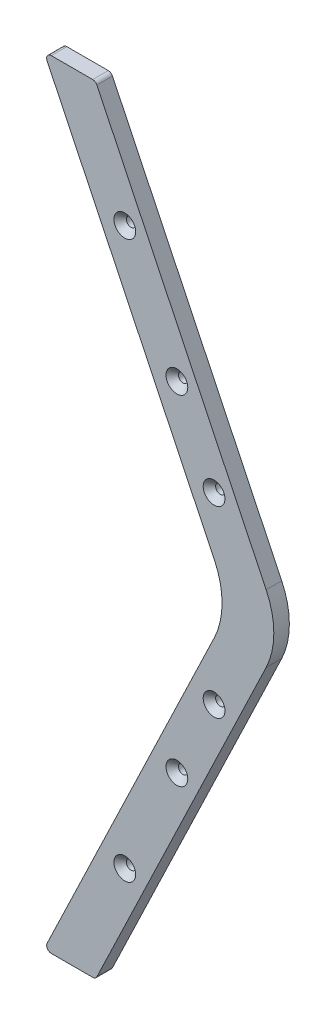
ISO-10303-21;
HEADER;
FILE_DESCRIPTION(('STEP AP214'),'2;1');
FILE_NAME('part.step','',(''),(''),'','','');
FILE_SCHEMA(('AUTOMOTIVE_DESIGN { 1 0 10303 214 1 1 1 1 }'));
ENDSEC;
DATA;
#1=APPLICATION_CONTEXT('core data for automotive mechanical design processes');
#2=APPLICATION_PROTOCOL_DEFINITION('international standard','automotive_design',2000,#1);
#3=PRODUCT_CONTEXT('',#1,'mechanical');
#4=PRODUCT('Part','Part','',(#3));
#5=PRODUCT_RELATED_PRODUCT_CATEGORY('part','',(#4));
#6=PRODUCT_DEFINITION_FORMATION('','',#4);
#7=PRODUCT_DEFINITION_CONTEXT('part definition',#1,'design');
#8=PRODUCT_DEFINITION('design','',#6,#7);
#9=PRODUCT_DEFINITION_SHAPE('','',#8);
#10=(LENGTH_UNIT() NAMED_UNIT(*) SI_UNIT(.MILLI.,.METRE.));
#11=(NAMED_UNIT(*) PLANE_ANGLE_UNIT() SI_UNIT($,.RADIAN.));
#12=(NAMED_UNIT(*) SI_UNIT($,.STERADIAN.) SOLID_ANGLE_UNIT());
#13=UNCERTAINTY_MEASURE_WITH_UNIT(LENGTH_MEASURE(1.E-05),#10,'distance_accuracy_value','');
#14=(GEOMETRIC_REPRESENTATION_CONTEXT(3) GLOBAL_UNCERTAINTY_ASSIGNED_CONTEXT((#13)) GLOBAL_UNIT_ASSIGNED_CONTEXT((#10,
#11,#12)) REPRESENTATION_CONTEXT('',''));
#15=CARTESIAN_POINT('',(0.,0.,0.));
#16=DIRECTION('',(0.,0.,1.));
#17=DIRECTION('',(1.,0.,0.));
#18=AXIS2_PLACEMENT_3D('',#15,#16,#17);
#19=CARTESIAN_POINT('',(-19.6172248803829,250.,10.));
#20=DIRECTION('',(0.,-1.,0.));
#21=DIRECTION('',(1.,0.,0.));
#22=AXIS2_PLACEMENT_3D('',#19,#20,#21);
#23=PLANE('',#22);
#24=DIRECTION('',(-1.,0.,0.));
#25=VECTOR('',#24,1.);
#26=CARTESIAN_POINT('',(-19.6172248803829,250.,0.));
#27=LINE('',#26,#25);
#28=CARTESIAN_POINT('',(11.7747507084557,250.,0.));
#29=VERTEX_POINT('',#28);
#30=CARTESIAN_POINT('',(-14.8487448678703,250.,0.));
#31=VERTEX_POINT('',#30);
#32=EDGE_CURVE('E236',#29,#31,#27,.T.);
#33=ORIENTED_EDGE('',*,*,#32,.T.);
#34=DIRECTION('',(0.,0.,-1.));
#35=VECTOR('',#34,1.);
#36=CARTESIAN_POINT('',(-14.8487448678703,250.,10.));
#37=LINE('',#36,#35);
#38=CARTESIAN_POINT('',(-14.8487448678703,250.,10.));
#39=VERTEX_POINT('',#38);
#40=EDGE_CURVE('E196',#31,#39,#37,.F.);
#41=ORIENTED_EDGE('',*,*,#40,.T.);
#42=DIRECTION('',(-1.,0.,0.));
#43=VECTOR('',#42,1.);
#44=CARTESIAN_POINT('',(-19.6172248803829,250.,10.));
#45=LINE('',#44,#43);
#46=CARTESIAN_POINT('',(11.7747507084557,250.,10.));
#47=VERTEX_POINT('',#46);
#48=EDGE_CURVE('E170',#47,#39,#45,.T.);
#49=ORIENTED_EDGE('',*,*,#48,.F.);
#50=DIRECTION('',(0.,0.,-1.));
#51=VECTOR('',#50,1.);
#52=CARTESIAN_POINT('',(11.7747507084557,250.,10.));
#53=LINE('',#52,#51);
#54=EDGE_CURVE('E193',#47,#29,#53,.T.);
#55=ORIENTED_EDGE('',*,*,#54,.T.);
#56=EDGE_LOOP('',(#33,#41,#49,#55));
#57=FACE_BOUND('',#56,.T.);
#58=ADVANCED_FACE('F40',(#57),#23,.F.);
#59=CARTESIAN_POINT('',(100.428030575602,0.,10.));
#60=DIRECTION('',(0.901459386923673,0.432863689545792,0.));
#61=DIRECTION('',(-0.432863689545792,0.901459386923673,0.));
#62=AXIS2_PLACEMENT_3D('',#59,#60,#61);
#63=PLANE('',#62);
#64=DIRECTION('',(0.432863689545792,-0.901459386923673,0.));
#65=VECTOR('',#64,1.);
#66=CARTESIAN_POINT('',(100.428030575602,0.,0.));
#67=LINE('',#66,#65);
#68=CARTESIAN_POINT('',(-17.5531230286413,245.701408931363,0.));
#69=VERTEX_POINT('',#68);
#70=CARTESIAN_POINT('',(90.0353841377733,21.6431844772896,0.));
#71=VERTEX_POINT('',#70);
#72=EDGE_CURVE('E165',#69,#71,#67,.T.);
#73=ORIENTED_EDGE('',*,*,#72,.T.);
#74=DIRECTION('',(0.,0.,-1.));
#75=VECTOR('',#74,1.);
#76=CARTESIAN_POINT('',(90.0353841377733,21.6431844772896,10.));
#77=LINE('',#76,#75);
#78=CARTESIAN_POINT('',(90.0353841377733,21.6431844772896,10.));
#79=VERTEX_POINT('',#78);
#80=EDGE_CURVE('E56',#71,#79,#77,.F.);
#81=ORIENTED_EDGE('',*,*,#80,.T.);
#82=DIRECTION('',(0.432863689545792,-0.901459386923673,0.));
#83=VECTOR('',#82,1.);
#84=CARTESIAN_POINT('',(100.428030575602,0.,10.));
#85=LINE('',#84,#83);
#86=CARTESIAN_POINT('',(-17.5531230286413,245.701408931363,10.));
#87=VERTEX_POINT('',#86);
#88=EDGE_CURVE('E400',#87,#79,#85,.T.);
#89=ORIENTED_EDGE('',*,*,#88,.F.);
#90=DIRECTION('',(0.,0.,-1.));
#91=VECTOR('',#90,1.);
#92=CARTESIAN_POINT('',(-17.5531230286413,245.701408931363,10.));
#93=LINE('',#92,#91);
#94=EDGE_CURVE('E190',#87,#69,#93,.T.);
#95=ORIENTED_EDGE('',*,*,#94,.T.);
#96=EDGE_LOOP('',(#73,#81,#89,#95));
#97=FACE_BOUND('',#96,.T.);
#98=ADVANCED_FACE('F286',(#97),#63,.F.);
#99=CARTESIAN_POINT('',(100.428030575602,0.,10.));
#100=DIRECTION('',(0.901459386923673,-0.432863689545792,0.));
#101=DIRECTION('',(0.432863689545792,0.901459386923673,0.));
#102=AXIS2_PLACEMENT_3D('',#99,#100,#101);
#103=PLANE('',#102);
#104=DIRECTION('',(-0.432863689545792,-0.901459386923673,0.));
#105=VECTOR('',#104,1.);
#106=CARTESIAN_POINT('',(100.428030575602,0.,10.));
#107=LINE('',#106,#105);
#108=CARTESIAN_POINT('',(90.0353841377733,-21.6431844772896,10.));
#109=VERTEX_POINT('',#108);
#110=CARTESIAN_POINT('',(-17.5531230286412,-245.701408931363,10.));
#111=VERTEX_POINT('',#110);
#112=EDGE_CURVE('E398',#109,#111,#107,.T.);
#113=ORIENTED_EDGE('',*,*,#112,.F.);
#114=DIRECTION('',(0.,0.,-1.));
#115=VECTOR('',#114,1.);
#116=CARTESIAN_POINT('',(90.0353841377733,-21.6431844772896,0.));
#117=LINE('',#116,#115);
#118=CARTESIAN_POINT('',(90.0353841377733,-21.6431844772896,0.));
#119=VERTEX_POINT('',#118);
#120=EDGE_CURVE('E210',#109,#119,#117,.T.);
#121=ORIENTED_EDGE('',*,*,#120,.T.);
#122=DIRECTION('',(-0.432863689545792,-0.901459386923673,0.));
#123=VECTOR('',#122,1.);
#124=CARTESIAN_POINT('',(100.428030575602,0.,0.));
#125=LINE('',#124,#123);
#126=CARTESIAN_POINT('',(-17.5531230286412,-245.701408931363,0.));
#127=VERTEX_POINT('',#126);
#128=EDGE_CURVE('E160',#119,#127,#125,.T.);
#129=ORIENTED_EDGE('',*,*,#128,.T.);
#130=DIRECTION('',(0.,0.,-1.));
#131=VECTOR('',#130,1.);
#132=CARTESIAN_POINT('',(-17.5531230286412,-245.701408931363,10.));
#133=LINE('',#132,#131);
#134=EDGE_CURVE('E139',#127,#111,#133,.F.);
#135=ORIENTED_EDGE('',*,*,#134,.T.);
#136=EDGE_LOOP('',(#113,#121,#129,#135));
#137=FACE_BOUND('',#136,.T.);
#138=ADVANCED_FACE('F292',(#137),#103,.F.);
#139=CARTESIAN_POINT('',(-19.6172248803828,-250.,10.));
#140=DIRECTION('',(0.,1.,0.));
#141=DIRECTION('',(0.,0.,1.));
#142=AXIS2_PLACEMENT_3D('',#139,#140,#141);
#143=PLANE('',#142);
#144=DIRECTION('',(1.,0.,0.));
#145=VECTOR('',#144,1.);
#146=CARTESIAN_POINT('',(-19.6172248803828,-250.,10.));
#147=LINE('',#146,#145);
#148=CARTESIAN_POINT('',(-14.8487448678702,-250.,10.));
#149=VERTEX_POINT('',#148);
#150=CARTESIAN_POINT('',(11.7747507084557,-250.,10.));
#151=VERTEX_POINT('',#150);
#152=EDGE_CURVE('E152',#149,#151,#147,.T.);
#153=ORIENTED_EDGE('',*,*,#152,.F.);
#154=DIRECTION('',(0.,0.,-1.));
#155=VECTOR('',#154,1.);
#156=CARTESIAN_POINT('',(-14.8487448678702,-250.,10.));
#157=LINE('',#156,#155);
#158=CARTESIAN_POINT('',(-14.8487448678702,-250.,0.));
#159=VERTEX_POINT('',#158);
#160=EDGE_CURVE('E137',#149,#159,#157,.T.);
#161=ORIENTED_EDGE('',*,*,#160,.T.);
#162=DIRECTION('',(1.,0.,0.));
#163=VECTOR('',#162,1.);
#164=CARTESIAN_POINT('',(-19.6172248803828,-250.,0.));
#165=LINE('',#164,#163);
#166=CARTESIAN_POINT('',(11.7747507084557,-250.,0.));
#167=VERTEX_POINT('',#166);
#168=EDGE_CURVE('E149',#159,#167,#165,.T.);
#169=ORIENTED_EDGE('',*,*,#168,.T.);
#170=DIRECTION('',(0.,0.,-1.));
#171=VECTOR('',#170,1.);
#172=CARTESIAN_POINT('',(11.7747507084557,-250.,10.));
#173=LINE('',#172,#171);
#174=EDGE_CURVE('E154',#167,#151,#173,.F.);
#175=ORIENTED_EDGE('',*,*,#174,.T.);
#176=EDGE_LOOP('',(#153,#161,#169,#175));
#177=FACE_BOUND('',#176,.T.);
#178=ADVANCED_FACE('F148',(#177),#143,.F.);
#179=CARTESIAN_POINT('',(13.6621445900246,-250.,10.));
#180=DIRECTION('',(-0.901459386923672,0.432863689545793,0.));
#181=DIRECTION('',(-0.432863689545793,-0.901459386923673,0.));
#182=AXIS2_PLACEMENT_3D('',#179,#180,#181);
#183=PLANE('',#182);
#184=DIRECTION('',(0.432863689545793,0.901459386923672,0.));
#185=VECTOR('',#184,1.);
#186=CARTESIAN_POINT('',(13.6621445900246,-250.,0.));
#187=LINE('',#186,#185);
#188=CARTESIAN_POINT('',(14.4791288692267,-248.298591068637,0.));
#189=VERTEX_POINT('',#188);
#190=CARTESIAN_POINT('',(123.314753608181,-21.6431844772899,0.));
#191=VERTEX_POINT('',#190);
#192=EDGE_CURVE('E159',#189,#191,#187,.T.);
#193=ORIENTED_EDGE('',*,*,#192,.T.);
#194=DIRECTION('',(0.,0.,-1.));
#195=VECTOR('',#194,1.);
#196=CARTESIAN_POINT('',(123.314753608181,-21.6431844772899,10.));
#197=LINE('',#196,#195);
#198=CARTESIAN_POINT('',(123.314753608181,-21.6431844772899,10.));
#199=VERTEX_POINT('',#198);
#200=EDGE_CURVE('E206',#191,#199,#197,.F.);
#201=ORIENTED_EDGE('',*,*,#200,.T.);
#202=DIRECTION('',(0.432863689545793,0.901459386923672,0.));
#203=VECTOR('',#202,1.);
#204=CARTESIAN_POINT('',(13.6621445900246,-250.,10.));
#205=LINE('',#204,#203);
#206=CARTESIAN_POINT('',(14.4791288692267,-248.298591068637,10.));
#207=VERTEX_POINT('',#206);
#208=EDGE_CURVE('E407',#207,#199,#205,.T.);
#209=ORIENTED_EDGE('',*,*,#208,.F.);
#210=DIRECTION('',(0.,0.,-1.));
#211=VECTOR('',#210,1.);
#212=CARTESIAN_POINT('',(14.4791288692267,-248.298591068637,10.));
#213=LINE('',#212,#211);
#214=EDGE_CURVE('E187',#207,#189,#213,.T.);
#215=ORIENTED_EDGE('',*,*,#214,.T.);
#216=EDGE_LOOP('',(#193,#201,#209,#215));
#217=FACE_BOUND('',#216,.T.);
#218=ADVANCED_FACE('F388',(#217),#183,.F.);
#219=CARTESIAN_POINT('',(133.70740004601,-2.46330733588707E-13,10.));
#220=DIRECTION('',(-0.901459386923673,-0.432863689545792,0.));
#221=DIRECTION('',(0.432863689545792,-0.901459386923673,0.));
#222=AXIS2_PLACEMENT_3D('',#219,#220,#221);
#223=PLANE('',#222);
#224=DIRECTION('',(-0.432863689545792,0.901459386923673,0.));
#225=VECTOR('',#224,1.);
#226=CARTESIAN_POINT('',(133.70740004601,-2.46330733588707E-13,10.));
#227=LINE('',#226,#225);
#228=CARTESIAN_POINT('',(123.314753608181,21.6431844772894,10.));
#229=VERTEX_POINT('',#228);
#230=CARTESIAN_POINT('',(14.4791288692267,248.298591068637,10.));
#231=VERTEX_POINT('',#230);
#232=EDGE_CURVE('E171',#229,#231,#227,.T.);
#233=ORIENTED_EDGE('',*,*,#232,.F.);
#234=DIRECTION('',(0.,0.,-1.));
#235=VECTOR('',#234,1.);
#236=CARTESIAN_POINT('',(123.314753608181,21.6431844772894,10.));
#237=LINE('',#236,#235);
#238=CARTESIAN_POINT('',(123.314753608181,21.6431844772894,0.));
#239=VERTEX_POINT('',#238);
#240=EDGE_CURVE('E201',#229,#239,#237,.T.);
#241=ORIENTED_EDGE('',*,*,#240,.T.);
#242=DIRECTION('',(-0.432863689545792,0.901459386923673,0.));
#243=VECTOR('',#242,1.);
#244=CARTESIAN_POINT('',(133.70740004601,-2.46330733588707E-13,0.));
#245=LINE('',#244,#243);
#246=CARTESIAN_POINT('',(14.4791288692267,248.298591068637,0.));
#247=VERTEX_POINT('',#246);
#248=EDGE_CURVE('E163',#239,#247,#245,.T.);
#249=ORIENTED_EDGE('',*,*,#248,.T.);
#250=DIRECTION('',(0.,0.,-1.));
#251=VECTOR('',#250,1.);
#252=CARTESIAN_POINT('',(14.4791288692267,248.298591068637,10.));
#253=LINE('',#252,#251);
#254=EDGE_CURVE('E198',#247,#231,#253,.F.);
#255=ORIENTED_EDGE('',*,*,#254,.T.);
#256=EDGE_LOOP('',(#233,#241,#249,#255));
#257=FACE_BOUND('',#256,.T.);
#258=ADVANCED_FACE('F383',(#257),#223,.F.);
#259=CARTESIAN_POINT('',(0.,0.,10.));
#260=DIRECTION('',(0.,0.,1.));
#261=DIRECTION('',(1.,0.,0.));
#262=AXIS2_PLACEMENT_3D('',#259,#260,#261);
#263=PLANE('',#262);
#264=CARTESIAN_POINT('',(32.4180578018407,-179.,10.));
#265=DIRECTION('',(0.,0.,1.));
#266=DIRECTION('',(1.,0.,0.));
#267=AXIS2_PLACEMENT_3D('',#264,#265,#266);
#268=CIRCLE('',#267,7.00000000000001);
#269=CARTESIAN_POINT('',(39.4180578018407,-179.,10.));
#270=VERTEX_POINT('',#269);
#271=EDGE_CURVE('E254',#270,#270,#268,.F.);
#272=ORIENTED_EDGE('',*,*,#271,.T.);
#273=EDGE_LOOP('',(#272));
#274=FACE_BOUND('',#273,.T.);
#275=CARTESIAN_POINT('',(65.9108807683479,-109.,10.));
#276=DIRECTION('',(0.,0.,1.));
#277=DIRECTION('',(1.,0.,0.));
#278=AXIS2_PLACEMENT_3D('',#275,#276,#277);
#279=CIRCLE('',#278,7.00000000000001);
#280=CARTESIAN_POINT('',(72.9108807683479,-109.,10.));
#281=VERTEX_POINT('',#280);
#282=EDGE_CURVE('E251',#281,#281,#279,.F.);
#283=ORIENTED_EDGE('',*,*,#282,.T.);
#284=EDGE_LOOP('',(#283));
#285=FACE_BOUND('',#284,.T.);
#286=CARTESIAN_POINT('',(89.8343257444245,-59.,10.));
#287=DIRECTION('',(0.,0.,1.));
#288=DIRECTION('',(1.,0.,0.));
#289=AXIS2_PLACEMENT_3D('',#286,#287,#288);
#290=CIRCLE('',#289,7.00000000000001);
#291=CARTESIAN_POINT('',(96.8343257444245,-59.,10.));
#292=VERTEX_POINT('',#291);
#293=EDGE_CURVE('E248',#292,#292,#290,.F.);
#294=ORIENTED_EDGE('',*,*,#293,.T.);
#295=EDGE_LOOP('',(#294));
#296=FACE_BOUND('',#295,.T.);
#297=CARTESIAN_POINT('',(89.8343257444244,59.,10.));
#298=DIRECTION('',(0.,0.,1.));
#299=DIRECTION('',(1.,0.,0.));
#300=AXIS2_PLACEMENT_3D('',#297,#298,#299);
#301=CIRCLE('',#300,7.00000000000001);
#302=CARTESIAN_POINT('',(96.8343257444244,59.,10.));
#303=VERTEX_POINT('',#302);
#304=EDGE_CURVE('E245',#303,#303,#301,.F.);
#305=ORIENTED_EDGE('',*,*,#304,.T.);
#306=EDGE_LOOP('',(#305));
#307=FACE_BOUND('',#306,.T.);
#308=CARTESIAN_POINT('',(65.9108807683478,109.,10.));
#309=DIRECTION('',(0.,0.,1.));
#310=DIRECTION('',(1.,0.,0.));
#311=AXIS2_PLACEMENT_3D('',#308,#309,#310);
#312=CIRCLE('',#311,7.00000000000001);
#313=CARTESIAN_POINT('',(72.9108807683478,109.,10.));
#314=VERTEX_POINT('',#313);
#315=EDGE_CURVE('E242',#314,#314,#312,.F.);
#316=ORIENTED_EDGE('',*,*,#315,.T.);
#317=EDGE_LOOP('',(#316));
#318=FACE_BOUND('',#317,.T.);
#319=CARTESIAN_POINT('',(32.4180578018406,179.,10.));
#320=DIRECTION('',(0.,0.,1.));
#321=DIRECTION('',(1.,0.,0.));
#322=AXIS2_PLACEMENT_3D('',#319,#320,#321);
#323=CIRCLE('',#322,7.00000000000001);
#324=CARTESIAN_POINT('',(39.4180578018406,179.,10.));
#325=VERTEX_POINT('',#324);
#326=EDGE_CURVE('E239',#325,#325,#323,.F.);
#327=ORIENTED_EDGE('',*,*,#326,.T.);
#328=EDGE_LOOP('',(#327));
#329=FACE_BOUND('',#328,.T.);
#330=ORIENTED_EDGE('',*,*,#208,.T.);
#331=CARTESIAN_POINT('',(78.2417842619973,-2.39391839684799E-13,10.));
#332=DIRECTION('',(0.,0.,1.));
#333=DIRECTION('',(1.,0.,0.));
#334=AXIS2_PLACEMENT_3D('',#331,#332,#333);
#335=CIRCLE('',#334,50.);
#336=EDGE_CURVE('E208',#199,#229,#335,.T.);
#337=ORIENTED_EDGE('',*,*,#336,.T.);
#338=ORIENTED_EDGE('',*,*,#232,.T.);
#339=CARTESIAN_POINT('',(11.7747507084557,247.,10.));
#340=DIRECTION('',(0.,0.,1.));
#341=DIRECTION('',(1.,0.,0.));
#342=AXIS2_PLACEMENT_3D('',#339,#340,#341);
#343=CIRCLE('',#342,3.);
#344=EDGE_CURVE('E179',#231,#47,#343,.T.);
#345=ORIENTED_EDGE('',*,*,#344,.T.);
#346=ORIENTED_EDGE('',*,*,#48,.T.);
#347=CARTESIAN_POINT('',(-14.8487448678703,247.,10.));
#348=DIRECTION('',(0.,0.,1.));
#349=DIRECTION('',(1.,0.,0.));
#350=AXIS2_PLACEMENT_3D('',#347,#348,#349);
#351=CIRCLE('',#350,3.);
#352=EDGE_CURVE('E181',#39,#87,#351,.T.);
#353=ORIENTED_EDGE('',*,*,#352,.T.);
#354=ORIENTED_EDGE('',*,*,#88,.T.);
#355=CARTESIAN_POINT('',(44.9624147915897,0.,10.));
#356=DIRECTION('',(0.,0.,1.));
#357=DIRECTION('',(1.,0.,0.));
#358=AXIS2_PLACEMENT_3D('',#355,#356,#357);
#359=CIRCLE('',#358,50.);
#360=EDGE_CURVE('E63',#79,#109,#359,.F.);
#361=ORIENTED_EDGE('',*,*,#360,.T.);
#362=ORIENTED_EDGE('',*,*,#112,.T.);
#363=CARTESIAN_POINT('',(-14.8487448678702,-247.,10.));
#364=DIRECTION('',(0.,0.,1.));
#365=DIRECTION('',(1.,0.,0.));
#366=AXIS2_PLACEMENT_3D('',#363,#364,#365);
#367=CIRCLE('',#366,3.);
#368=EDGE_CURVE('E185',#111,#149,#367,.T.);
#369=ORIENTED_EDGE('',*,*,#368,.T.);
#370=ORIENTED_EDGE('',*,*,#152,.T.);
#371=CARTESIAN_POINT('',(11.7747507084557,-247.,10.));
#372=DIRECTION('',(0.,0.,1.));
#373=DIRECTION('',(1.,0.,0.));
#374=AXIS2_PLACEMENT_3D('',#371,#372,#373);
#375=CIRCLE('',#374,3.);
#376=EDGE_CURVE('E183',#151,#207,#375,.T.);
#377=ORIENTED_EDGE('',*,*,#376,.T.);
#378=EDGE_LOOP('',(#330,#337,#338,#345,#346,#353,#354,#361,#362,#369,#370,#377));
#379=FACE_BOUND('',#378,.T.);
#380=ADVANCED_FACE('F362',(#274,#285,#296,#307,#318,#329,#379),#263,.T.);
#381=CARTESIAN_POINT('',(0.,0.,0.));
#382=DIRECTION('',(0.,0.,1.));
#383=DIRECTION('',(1.,0.,0.));
#384=AXIS2_PLACEMENT_3D('',#381,#382,#383);
#385=PLANE('',#384);
#386=CARTESIAN_POINT('',(32.4180578018407,-179.,0.));
#387=DIRECTION('',(0.,0.,1.));
#388=DIRECTION('',(1.,0.,0.));
#389=AXIS2_PLACEMENT_3D('',#386,#387,#388);
#390=CIRCLE('',#389,3.);
#391=CARTESIAN_POINT('',(35.4180578018407,-179.,0.));
#392=VERTEX_POINT('',#391);
#393=EDGE_CURVE('E233',#392,#392,#390,.T.);
#394=ORIENTED_EDGE('',*,*,#393,.T.);
#395=EDGE_LOOP('',(#394));
#396=FACE_BOUND('',#395,.T.);
#397=CARTESIAN_POINT('',(65.9108807683479,-109.,0.));
#398=DIRECTION('',(0.,0.,1.));
#399=DIRECTION('',(1.,0.,0.));
#400=AXIS2_PLACEMENT_3D('',#397,#398,#399);
#401=CIRCLE('',#400,3.00000000000001);
#402=CARTESIAN_POINT('',(68.9108807683479,-109.,0.));
#403=VERTEX_POINT('',#402);
#404=EDGE_CURVE('E230',#403,#403,#401,.T.);
#405=ORIENTED_EDGE('',*,*,#404,.T.);
#406=EDGE_LOOP('',(#405));
#407=FACE_BOUND('',#406,.T.);
#408=CARTESIAN_POINT('',(89.8343257444245,-59.,0.));
#409=DIRECTION('',(0.,0.,1.));
#410=DIRECTION('',(1.,0.,0.));
#411=AXIS2_PLACEMENT_3D('',#408,#409,#410);
#412=CIRCLE('',#411,3.00000000000001);
#413=CARTESIAN_POINT('',(92.8343257444245,-59.,0.));
#414=VERTEX_POINT('',#413);
#415=EDGE_CURVE('E227',#414,#414,#412,.T.);
#416=ORIENTED_EDGE('',*,*,#415,.T.);
#417=EDGE_LOOP('',(#416));
#418=FACE_BOUND('',#417,.T.);
#419=CARTESIAN_POINT('',(65.9108807683478,109.,0.));
#420=DIRECTION('',(0.,0.,1.));
#421=DIRECTION('',(1.,0.,0.));
#422=AXIS2_PLACEMENT_3D('',#419,#420,#421);
#423=CIRCLE('',#422,3.00000000000001);
#424=CARTESIAN_POINT('',(68.9108807683478,109.,0.));
#425=VERTEX_POINT('',#424);
#426=EDGE_CURVE('E224',#425,#425,#423,.T.);
#427=ORIENTED_EDGE('',*,*,#426,.T.);
#428=EDGE_LOOP('',(#427));
#429=FACE_BOUND('',#428,.T.);
#430=CARTESIAN_POINT('',(89.8343257444244,59.,0.));
#431=DIRECTION('',(0.,0.,1.));
#432=DIRECTION('',(1.,0.,0.));
#433=AXIS2_PLACEMENT_3D('',#430,#431,#432);
#434=CIRCLE('',#433,3.00000000000001);
#435=CARTESIAN_POINT('',(92.8343257444244,59.,0.));
#436=VERTEX_POINT('',#435);
#437=EDGE_CURVE('E221',#436,#436,#434,.T.);
#438=ORIENTED_EDGE('',*,*,#437,.T.);
#439=EDGE_LOOP('',(#438));
#440=FACE_BOUND('',#439,.T.);
#441=CARTESIAN_POINT('',(32.4180578018406,179.,0.));
#442=DIRECTION('',(0.,0.,1.));
#443=DIRECTION('',(1.,0.,0.));
#444=AXIS2_PLACEMENT_3D('',#441,#442,#443);
#445=CIRCLE('',#444,3.);
#446=CARTESIAN_POINT('',(35.4180578018406,179.,0.));
#447=VERTEX_POINT('',#446);
#448=EDGE_CURVE('E218',#447,#447,#445,.T.);
#449=ORIENTED_EDGE('',*,*,#448,.T.);
#450=EDGE_LOOP('',(#449));
#451=FACE_BOUND('',#450,.T.);
#452=ORIENTED_EDGE('',*,*,#248,.F.);
#453=CARTESIAN_POINT('',(78.2417842619973,-2.39391839684799E-13,0.));
#454=DIRECTION('',(0.,0.,1.));
#455=DIRECTION('',(1.,0.,0.));
#456=AXIS2_PLACEMENT_3D('',#453,#454,#455);
#457=CIRCLE('',#456,50.);
#458=EDGE_CURVE('E204',#239,#191,#457,.F.);
#459=ORIENTED_EDGE('',*,*,#458,.T.);
#460=ORIENTED_EDGE('',*,*,#192,.F.);
#461=CARTESIAN_POINT('',(11.7747507084557,-247.,0.));
#462=DIRECTION('',(0.,0.,1.));
#463=DIRECTION('',(1.,0.,0.));
#464=AXIS2_PLACEMENT_3D('',#461,#462,#463);
#465=CIRCLE('',#464,3.);
#466=EDGE_CURVE('E143',#189,#167,#465,.F.);
#467=ORIENTED_EDGE('',*,*,#466,.T.);
#468=ORIENTED_EDGE('',*,*,#168,.F.);
#469=CARTESIAN_POINT('',(-14.8487448678702,-247.,0.));
#470=DIRECTION('',(0.,0.,1.));
#471=DIRECTION('',(1.,0.,0.));
#472=AXIS2_PLACEMENT_3D('',#469,#470,#471);
#473=CIRCLE('',#472,3.);
#474=EDGE_CURVE('E133',#159,#127,#473,.F.);
#475=ORIENTED_EDGE('',*,*,#474,.T.);
#476=ORIENTED_EDGE('',*,*,#128,.F.);
#477=CARTESIAN_POINT('',(44.9624147915897,0.,0.));
#478=DIRECTION('',(0.,0.,1.));
#479=DIRECTION('',(1.,0.,0.));
#480=AXIS2_PLACEMENT_3D('',#477,#478,#479);
#481=CIRCLE('',#480,50.);
#482=EDGE_CURVE('E214',#119,#71,#481,.T.);
#483=ORIENTED_EDGE('',*,*,#482,.T.);
#484=ORIENTED_EDGE('',*,*,#72,.F.);
#485=CARTESIAN_POINT('',(-14.8487448678703,247.,0.));
#486=DIRECTION('',(0.,0.,1.));
#487=DIRECTION('',(1.,0.,0.));
#488=AXIS2_PLACEMENT_3D('',#485,#486,#487);
#489=CIRCLE('',#488,3.);
#490=EDGE_CURVE('E175',#69,#31,#489,.F.);
#491=ORIENTED_EDGE('',*,*,#490,.T.);
#492=ORIENTED_EDGE('',*,*,#32,.F.);
#493=CARTESIAN_POINT('',(11.7747507084557,247.,0.));
#494=DIRECTION('',(0.,0.,1.));
#495=DIRECTION('',(1.,0.,0.));
#496=AXIS2_PLACEMENT_3D('',#493,#494,#495);
#497=CIRCLE('',#496,3.);
#498=EDGE_CURVE('E153',#29,#247,#497,.F.);
#499=ORIENTED_EDGE('',*,*,#498,.T.);
#500=EDGE_LOOP('',(#452,#459,#460,#467,#468,#475,#476,#483,#484,#491,#492,#499));
#501=FACE_BOUND('',#500,.T.);
#502=ADVANCED_FACE('F157',(#396,#407,#418,#429,#440,#451,#501),#385,.F.);
#503=CARTESIAN_POINT('',(-14.8487448678702,-247.,10.));
#504=DIRECTION('',(0.,0.,-1.));
#505=DIRECTION('',(-1.,0.,0.));
#506=AXIS2_PLACEMENT_3D('',#503,#504,#505);
#507=CYLINDRICAL_SURFACE('',#506,3.);
#508=ORIENTED_EDGE('',*,*,#368,.F.);
#509=ORIENTED_EDGE('',*,*,#134,.F.);
#510=ORIENTED_EDGE('',*,*,#474,.F.);
#511=ORIENTED_EDGE('',*,*,#160,.F.);
#512=EDGE_LOOP('',(#508,#509,#510,#511));
#513=FACE_BOUND('',#512,.T.);
#514=ADVANCED_FACE('F136',(#513),#507,.T.);
#515=CARTESIAN_POINT('',(11.7747507084557,-247.,10.));
#516=DIRECTION('',(0.,0.,-1.));
#517=DIRECTION('',(-1.,0.,0.));
#518=AXIS2_PLACEMENT_3D('',#515,#516,#517);
#519=CYLINDRICAL_SURFACE('',#518,3.);
#520=ORIENTED_EDGE('',*,*,#376,.F.);
#521=ORIENTED_EDGE('',*,*,#174,.F.);
#522=ORIENTED_EDGE('',*,*,#466,.F.);
#523=ORIENTED_EDGE('',*,*,#214,.F.);
#524=EDGE_LOOP('',(#520,#521,#522,#523));
#525=FACE_BOUND('',#524,.T.);
#526=ADVANCED_FACE('F299',(#525),#519,.T.);
#527=CARTESIAN_POINT('',(-14.8487448678703,247.,10.));
#528=DIRECTION('',(0.,0.,-1.));
#529=DIRECTION('',(-1.,0.,0.));
#530=AXIS2_PLACEMENT_3D('',#527,#528,#529);
#531=CYLINDRICAL_SURFACE('',#530,3.);
#532=ORIENTED_EDGE('',*,*,#352,.F.);
#533=ORIENTED_EDGE('',*,*,#40,.F.);
#534=ORIENTED_EDGE('',*,*,#490,.F.);
#535=ORIENTED_EDGE('',*,*,#94,.F.);
#536=EDGE_LOOP('',(#532,#533,#534,#535));
#537=FACE_BOUND('',#536,.T.);
#538=ADVANCED_FACE('F302',(#537),#531,.T.);
#539=CARTESIAN_POINT('',(11.7747507084557,247.,10.));
#540=DIRECTION('',(0.,0.,-1.));
#541=DIRECTION('',(-1.,0.,0.));
#542=AXIS2_PLACEMENT_3D('',#539,#540,#541);
#543=CYLINDRICAL_SURFACE('',#542,3.);
#544=ORIENTED_EDGE('',*,*,#344,.F.);
#545=ORIENTED_EDGE('',*,*,#254,.F.);
#546=ORIENTED_EDGE('',*,*,#498,.F.);
#547=ORIENTED_EDGE('',*,*,#54,.F.);
#548=EDGE_LOOP('',(#544,#545,#546,#547));
#549=FACE_BOUND('',#548,.T.);
#550=ADVANCED_FACE('F306',(#549),#543,.T.);
#551=CARTESIAN_POINT('',(78.2417842619973,-2.39391839684799E-13,10.));
#552=DIRECTION('',(0.,0.,-1.));
#553=DIRECTION('',(-1.,0.,0.));
#554=AXIS2_PLACEMENT_3D('',#551,#552,#553);
#555=CYLINDRICAL_SURFACE('',#554,50.);
#556=ORIENTED_EDGE('',*,*,#336,.F.);
#557=ORIENTED_EDGE('',*,*,#200,.F.);
#558=ORIENTED_EDGE('',*,*,#458,.F.);
#559=ORIENTED_EDGE('',*,*,#240,.F.);
#560=EDGE_LOOP('',(#556,#557,#558,#559));
#561=FACE_BOUND('',#560,.T.);
#562=ADVANCED_FACE('F310',(#561),#555,.T.);
#563=CARTESIAN_POINT('',(44.9624147915897,0.,10.));
#564=DIRECTION('',(0.,0.,1.));
#565=DIRECTION('',(1.,0.,0.));
#566=AXIS2_PLACEMENT_3D('',#563,#564,#565);
#567=CYLINDRICAL_SURFACE('',#566,50.);
#568=ORIENTED_EDGE('',*,*,#360,.F.);
#569=ORIENTED_EDGE('',*,*,#80,.F.);
#570=ORIENTED_EDGE('',*,*,#482,.F.);
#571=ORIENTED_EDGE('',*,*,#120,.F.);
#572=EDGE_LOOP('',(#568,#569,#570,#571));
#573=FACE_BOUND('',#572,.T.);
#574=ADVANCED_FACE('F314',(#573),#567,.F.);
#575=CARTESIAN_POINT('',(32.4180578018406,179.,-58.));
#576=DIRECTION('',(0.,0.,1.));
#577=DIRECTION('',(1.,0.,0.));
#578=AXIS2_PLACEMENT_3D('',#575,#576,#577);
#579=CYLINDRICAL_SURFACE('',#578,3.);
#580=CARTESIAN_POINT('',(32.4180578018406,179.,5.99999999999998));
#581=DIRECTION('',(0.,0.,1.));
#582=DIRECTION('',(1.,0.,0.));
#583=AXIS2_PLACEMENT_3D('',#580,#581,#582);
#584=CIRCLE('',#583,3.);
#585=CARTESIAN_POINT('',(35.4180578018406,179.,5.99999999999998));
#586=VERTEX_POINT('',#585);
#587=EDGE_CURVE('E11',#586,#586,#584,.T.);
#588=ORIENTED_EDGE('',*,*,#587,.T.);
#589=EDGE_LOOP('',(#588));
#590=FACE_BOUND('',#589,.T.);
#591=ORIENTED_EDGE('',*,*,#448,.F.);
#592=EDGE_LOOP('',(#591));
#593=FACE_BOUND('',#592,.T.);
#594=ADVANCED_FACE('F318',(#590,#593),#579,.F.);
#595=CARTESIAN_POINT('',(89.8343257444244,59.,-58.));
#596=DIRECTION('',(0.,0.,1.));
#597=DIRECTION('',(1.,0.,0.));
#598=AXIS2_PLACEMENT_3D('',#595,#596,#597);
#599=CYLINDRICAL_SURFACE('',#598,3.00000000000001);
#600=CARTESIAN_POINT('',(89.8343257444244,59.,6.));
#601=DIRECTION('',(0.,0.,1.));
#602=DIRECTION('',(1.,0.,0.));
#603=AXIS2_PLACEMENT_3D('',#600,#601,#602);
#604=CIRCLE('',#603,3.00000000000001);
#605=CARTESIAN_POINT('',(92.8343257444244,59.,6.));
#606=VERTEX_POINT('',#605);
#607=EDGE_CURVE('E263',#606,#606,#604,.T.);
#608=ORIENTED_EDGE('',*,*,#607,.T.);
#609=EDGE_LOOP('',(#608));
#610=FACE_BOUND('',#609,.T.);
#611=ORIENTED_EDGE('',*,*,#437,.F.);
#612=EDGE_LOOP('',(#611));
#613=FACE_BOUND('',#612,.T.);
#614=ADVANCED_FACE('F372',(#610,#613),#599,.F.);
#615=CARTESIAN_POINT('',(65.9108807683478,109.,-58.));
#616=DIRECTION('',(0.,0.,1.));
#617=DIRECTION('',(1.,0.,0.));
#618=AXIS2_PLACEMENT_3D('',#615,#616,#617);
#619=CYLINDRICAL_SURFACE('',#618,3.00000000000001);
#620=CARTESIAN_POINT('',(65.9108807683478,109.,6.));
#621=DIRECTION('',(0.,0.,1.));
#622=DIRECTION('',(1.,0.,0.));
#623=AXIS2_PLACEMENT_3D('',#620,#621,#622);
#624=CIRCLE('',#623,3.00000000000001);
#625=CARTESIAN_POINT('',(68.9108807683478,109.,6.));
#626=VERTEX_POINT('',#625);
#627=EDGE_CURVE('E49',#626,#626,#624,.T.);
#628=ORIENTED_EDGE('',*,*,#627,.T.);
#629=EDGE_LOOP('',(#628));
#630=FACE_BOUND('',#629,.T.);
#631=ORIENTED_EDGE('',*,*,#426,.F.);
#632=EDGE_LOOP('',(#631));
#633=FACE_BOUND('',#632,.T.);
#634=ADVANCED_FACE('F268',(#630,#633),#619,.F.);
#635=CARTESIAN_POINT('',(89.8343257444245,-59.,-58.));
#636=DIRECTION('',(0.,0.,1.));
#637=DIRECTION('',(1.,0.,0.));
#638=AXIS2_PLACEMENT_3D('',#635,#636,#637);
#639=CYLINDRICAL_SURFACE('',#638,3.00000000000001);
#640=CARTESIAN_POINT('',(89.8343257444245,-59.,6.));
#641=DIRECTION('',(0.,0.,1.));
#642=DIRECTION('',(1.,0.,0.));
#643=AXIS2_PLACEMENT_3D('',#640,#641,#642);
#644=CIRCLE('',#643,3.00000000000001);
#645=CARTESIAN_POINT('',(92.8343257444245,-59.,6.));
#646=VERTEX_POINT('',#645);
#647=EDGE_CURVE('E260',#646,#646,#644,.T.);
#648=ORIENTED_EDGE('',*,*,#647,.T.);
#649=EDGE_LOOP('',(#648));
#650=FACE_BOUND('',#649,.T.);
#651=ORIENTED_EDGE('',*,*,#415,.F.);
#652=EDGE_LOOP('',(#651));
#653=FACE_BOUND('',#652,.T.);
#654=ADVANCED_FACE('F353',(#650,#653),#639,.F.);
#655=CARTESIAN_POINT('',(65.9108807683479,-109.,-58.));
#656=DIRECTION('',(0.,0.,1.));
#657=DIRECTION('',(1.,0.,0.));
#658=AXIS2_PLACEMENT_3D('',#655,#656,#657);
#659=CYLINDRICAL_SURFACE('',#658,3.00000000000001);
#660=CARTESIAN_POINT('',(65.9108807683479,-109.,6.));
#661=DIRECTION('',(0.,0.,1.));
#662=DIRECTION('',(1.,0.,0.));
#663=AXIS2_PLACEMENT_3D('',#660,#661,#662);
#664=CIRCLE('',#663,3.00000000000001);
#665=CARTESIAN_POINT('',(68.9108807683479,-109.,6.));
#666=VERTEX_POINT('',#665);
#667=EDGE_CURVE('E257',#666,#666,#664,.T.);
#668=ORIENTED_EDGE('',*,*,#667,.T.);
#669=EDGE_LOOP('',(#668));
#670=FACE_BOUND('',#669,.T.);
#671=ORIENTED_EDGE('',*,*,#404,.F.);
#672=EDGE_LOOP('',(#671));
#673=FACE_BOUND('',#672,.T.);
#674=ADVANCED_FACE('F356',(#670,#673),#659,.F.);
#675=CARTESIAN_POINT('',(32.4180578018407,-179.,-58.));
#676=DIRECTION('',(0.,0.,1.));
#677=DIRECTION('',(1.,0.,0.));
#678=AXIS2_PLACEMENT_3D('',#675,#676,#677);
#679=CYLINDRICAL_SURFACE('',#678,3.);
#680=CARTESIAN_POINT('',(32.4180578018407,-179.,5.99999999999998));
#681=DIRECTION('',(0.,0.,1.));
#682=DIRECTION('',(1.,0.,0.));
#683=AXIS2_PLACEMENT_3D('',#680,#681,#682);
#684=CIRCLE('',#683,3.);
#685=CARTESIAN_POINT('',(35.4180578018407,-179.,5.99999999999998));
#686=VERTEX_POINT('',#685);
#687=EDGE_CURVE('E217',#686,#686,#684,.T.);
#688=ORIENTED_EDGE('',*,*,#687,.T.);
#689=EDGE_LOOP('',(#688));
#690=FACE_BOUND('',#689,.T.);
#691=ORIENTED_EDGE('',*,*,#393,.F.);
#692=EDGE_LOOP('',(#691));
#693=FACE_BOUND('',#692,.T.);
#694=ADVANCED_FACE('F328',(#690,#693),#679,.F.);
#695=CARTESIAN_POINT('',(32.4180578018407,-179.,5.99999999999998));
#696=DIRECTION('',(0.,0.,1.));
#697=DIRECTION('',(1.,0.,0.));
#698=AXIS2_PLACEMENT_3D('',#695,#696,#697);
#699=CONICAL_SURFACE('',#698,3.,0.785398163397447);
#700=ORIENTED_EDGE('',*,*,#271,.F.);
#701=EDGE_LOOP('',(#700));
#702=FACE_BOUND('',#701,.T.);
#703=ORIENTED_EDGE('',*,*,#687,.F.);
#704=EDGE_LOOP('',(#703));
#705=FACE_BOUND('',#704,.T.);
#706=ADVANCED_FACE('F321',(#702,#705),#699,.F.);
#707=CARTESIAN_POINT('',(65.9108807683479,-109.,6.));
#708=DIRECTION('',(0.,0.,1.));
#709=DIRECTION('',(1.,0.,0.));
#710=AXIS2_PLACEMENT_3D('',#707,#708,#709);
#711=CONICAL_SURFACE('',#710,3.00000000000001,0.785398163397449);
#712=ORIENTED_EDGE('',*,*,#282,.F.);
#713=EDGE_LOOP('',(#712));
#714=FACE_BOUND('',#713,.T.);
#715=ORIENTED_EDGE('',*,*,#667,.F.);
#716=EDGE_LOOP('',(#715));
#717=FACE_BOUND('',#716,.T.);
#718=ADVANCED_FACE('F327',(#714,#717),#711,.F.);
#719=CARTESIAN_POINT('',(89.8343257444245,-59.,6.));
#720=DIRECTION('',(0.,0.,1.));
#721=DIRECTION('',(1.,0.,0.));
#722=AXIS2_PLACEMENT_3D('',#719,#720,#721);
#723=CONICAL_SURFACE('',#722,3.00000000000001,0.785398163397448);
#724=ORIENTED_EDGE('',*,*,#293,.F.);
#725=EDGE_LOOP('',(#724));
#726=FACE_BOUND('',#725,.T.);
#727=ORIENTED_EDGE('',*,*,#647,.F.);
#728=EDGE_LOOP('',(#727));
#729=FACE_BOUND('',#728,.T.);
#730=ADVANCED_FACE('F280',(#726,#729),#723,.F.);
#731=CARTESIAN_POINT('',(89.8343257444244,59.,6.));
#732=DIRECTION('',(0.,0.,1.));
#733=DIRECTION('',(1.,0.,0.));
#734=AXIS2_PLACEMENT_3D('',#731,#732,#733);
#735=CONICAL_SURFACE('',#734,3.00000000000001,0.785398163397448);
#736=ORIENTED_EDGE('',*,*,#304,.F.);
#737=EDGE_LOOP('',(#736));
#738=FACE_BOUND('',#737,.T.);
#739=ORIENTED_EDGE('',*,*,#607,.F.);
#740=EDGE_LOOP('',(#739));
#741=FACE_BOUND('',#740,.T.);
#742=ADVANCED_FACE('F273',(#738,#741),#735,.F.);
#743=CARTESIAN_POINT('',(65.9108807683478,109.,6.));
#744=DIRECTION('',(0.,0.,1.));
#745=DIRECTION('',(1.,0.,0.));
#746=AXIS2_PLACEMENT_3D('',#743,#744,#745);
#747=CONICAL_SURFACE('',#746,3.00000000000001,0.785398163397449);
#748=ORIENTED_EDGE('',*,*,#315,.F.);
#749=EDGE_LOOP('',(#748));
#750=FACE_BOUND('',#749,.T.);
#751=ORIENTED_EDGE('',*,*,#627,.F.);
#752=EDGE_LOOP('',(#751));
#753=FACE_BOUND('',#752,.T.);
#754=ADVANCED_FACE('F271',(#750,#753),#747,.F.);
#755=CARTESIAN_POINT('',(32.4180578018406,179.,5.99999999999998));
#756=DIRECTION('',(0.,0.,1.));
#757=DIRECTION('',(1.,0.,0.));
#758=AXIS2_PLACEMENT_3D('',#755,#756,#757);
#759=CONICAL_SURFACE('',#758,3.,0.785398163397447);
#760=ORIENTED_EDGE('',*,*,#326,.F.);
#761=EDGE_LOOP('',(#760));
#762=FACE_BOUND('',#761,.T.);
#763=ORIENTED_EDGE('',*,*,#587,.F.);
#764=EDGE_LOOP('',(#763));
#765=FACE_BOUND('',#764,.T.);
#766=ADVANCED_FACE('F43',(#762,#765),#759,.F.);
#767=CLOSED_SHELL('',(#58,#98,#138,#178,#218,#258,#380,#502,#514,#526,#538,#550,#562,#574,#594,
#614,#634,#654,#674,#694,#706,#718,#730,#742,#754,#766));
#768=MANIFOLD_SOLID_BREP('B2',#767);
#769=ADVANCED_BREP_SHAPE_REPRESENTATION('',(#18,#768),#14);
#770=SHAPE_DEFINITION_REPRESENTATION(#9,#769);
ENDSEC;
END-ISO-10303-21;
